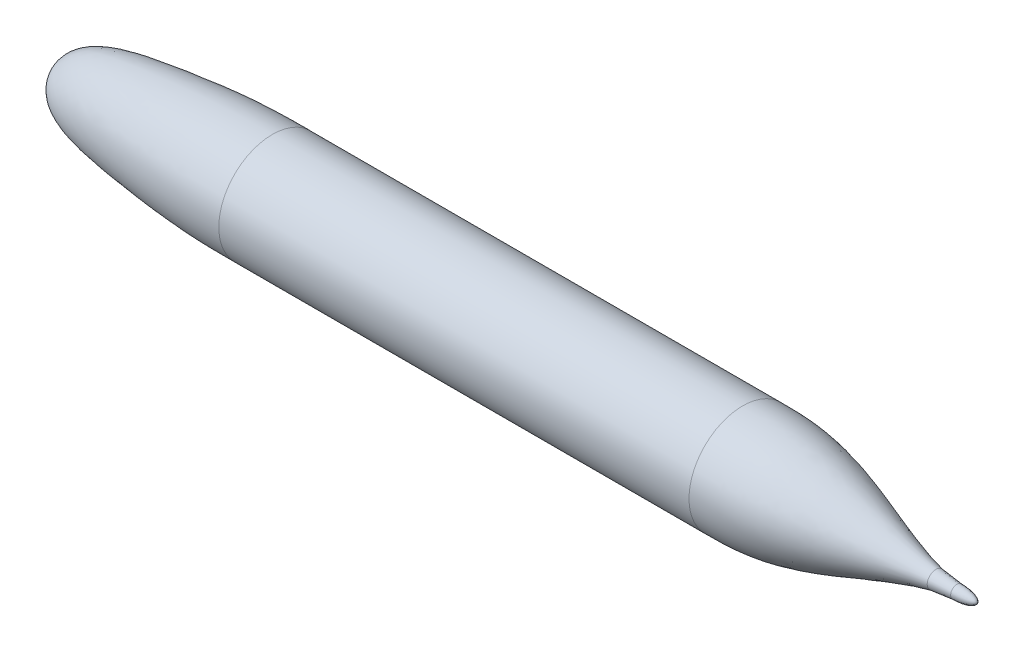
ISO-10303-21;
HEADER;
FILE_DESCRIPTION(('STEP AP214'),'2;1');
FILE_NAME('part.step','',(''),(''),'','','');
FILE_SCHEMA(('AUTOMOTIVE_DESIGN { 1 0 10303 214 1 1 1 1 }'));
ENDSEC;
DATA;
#1=APPLICATION_CONTEXT('core data for automotive mechanical design processes');
#2=APPLICATION_PROTOCOL_DEFINITION('international standard','automotive_design',2000,#1);
#3=PRODUCT_CONTEXT('',#1,'mechanical');
#4=PRODUCT('Part','Part','',(#3));
#5=PRODUCT_RELATED_PRODUCT_CATEGORY('part','',(#4));
#6=PRODUCT_DEFINITION_FORMATION('','',#4);
#7=PRODUCT_DEFINITION_CONTEXT('part definition',#1,'design');
#8=PRODUCT_DEFINITION('design','',#6,#7);
#9=PRODUCT_DEFINITION_SHAPE('','',#8);
#10=(LENGTH_UNIT() NAMED_UNIT(*) SI_UNIT(.MILLI.,.METRE.));
#11=(NAMED_UNIT(*) PLANE_ANGLE_UNIT() SI_UNIT($,.RADIAN.));
#12=(NAMED_UNIT(*) SI_UNIT($,.STERADIAN.) SOLID_ANGLE_UNIT());
#13=UNCERTAINTY_MEASURE_WITH_UNIT(LENGTH_MEASURE(1.E-05),#10,'distance_accuracy_value','');
#14=(GEOMETRIC_REPRESENTATION_CONTEXT(3) GLOBAL_UNCERTAINTY_ASSIGNED_CONTEXT((#13)) GLOBAL_UNIT_ASSIGNED_CONTEXT((#10,
#11,#12)) REPRESENTATION_CONTEXT('',''));
#15=CARTESIAN_POINT('',(0.,0.,0.));
#16=DIRECTION('',(0.,0.,1.));
#17=DIRECTION('',(1.,0.,0.));
#18=AXIS2_PLACEMENT_3D('',#15,#16,#17);
#19=CARTESIAN_POINT('',(4356.10056124605,0.,0.));
#20=DIRECTION('',(1.,0.,0.));
#21=DIRECTION('',(0.,0.,-1.));
#22=AXIS2_PLACEMENT_3D('',#19,#20,#21);
#23=PLANE('',#22);
#24=CARTESIAN_POINT('',(4356.0996825,0.,0.));
#25=DIRECTION('',(-1.,0.,0.));
#26=DIRECTION('',(0.,0.,-1.));
#27=AXIS2_PLACEMENT_3D('',#24,#25,#26);
#28=CIRCLE('',#27,0.0523166977989962);
#29=CARTESIAN_POINT('',(4356.0996825,0.,-0.0523166977989962));
#30=VERTEX_POINT('',#29);
#31=EDGE_CURVE('E11',#30,#30,#28,.F.);
#32=ORIENTED_EDGE('',*,*,#31,.T.);
#33=EDGE_LOOP('',(#32));
#34=FACE_BOUND('',#33,.T.);
#35=ADVANCED_FACE('F33',(#34),#23,.T.);
#36=CARTESIAN_POINT('',(4356.0996825,0.0523166977989962,0.));
#37=CARTESIAN_POINT('',(4356.09820510337,0.316375173884662,0.));
#38=CARTESIAN_POINT('',(4356.07328648779,0.873370162688149,0.));
#39=CARTESIAN_POINT('',(4355.97661854429,1.661731568693,0.));
#40=CARTESIAN_POINT('',(4355.73060631043,2.70263675821918,0.));
#41=CARTESIAN_POINT('',(4355.37771903531,3.73180193912385,0.));
#42=CARTESIAN_POINT('',(4354.88931306076,4.79395036815117,0.));
#43=CARTESIAN_POINT('',(4354.24380055822,5.91010552001094,0.));
#44=CARTESIAN_POINT('',(4353.40553185371,7.09434031631562,0.));
#45=CARTESIAN_POINT('',(4352.29516133093,8.40000321988059,0.));
#46=CARTESIAN_POINT('',(4350.8854069248,9.78923323718644,0.));
#47=CARTESIAN_POINT('',(4348.97726767036,11.381324846722,0.));
#48=CARTESIAN_POINT('',(4346.57909581715,13.0670533568304,0.));
#49=CARTESIAN_POINT('',(4343.61561851952,14.8313255512474,0.));
#50=CARTESIAN_POINT('',(4339.47901953081,16.9266101916491,0.));
#51=CARTESIAN_POINT('',(4334.34212574806,19.076095309961,0.));
#52=CARTESIAN_POINT('',(4328.25751531957,21.1786783680278,0.));
#53=CARTESIAN_POINT('',(4321.31870381039,23.1253204070093,0.));
#54=CARTESIAN_POINT('',(4314.37014831795,24.7519541055529,0.));
#55=CARTESIAN_POINT('',(4307.25196288843,26.1066906964655,0.));
#56=CARTESIAN_POINT('',(4300.27433543783,27.2230172646972,0.));
#57=CARTESIAN_POINT('',(4292.96906602332,28.1246545151776,0.));
#58=CARTESIAN_POINT('',(4286.13004348403,28.8286673265875,0.));
#59=CARTESIAN_POINT('',(4278.47083825818,29.3471768576665,0.));
#60=CARTESIAN_POINT('',(4272.13194197613,29.6885256465989,0.));
#61=CARTESIAN_POINT('',(4265.71990054262,29.8155871271278,0.));
#62=CARTESIAN_POINT('',(4262.49491853752,29.8438240903976,0.));
#63=CARTESIAN_POINT('',(4260.85,29.8438249999535,0.));
#64=B_SPLINE_CURVE_WITH_KNOTS('',4,(#36,#37,#38,#39,#40,#41,#42,#43,#44,#45,#46,#47,#48,#49,#50,
#51,#52,#53,#54,#55,#56,#57,#58,#59,#60,#61,#62,#63),.UNSPECIFIED.,.F.,.F.,(5,1,1,1,1,1,1,1,1,1,
1,1,1,1,1,1,1,1,1,1,1,1,1,1,5),(0.0831570128130642,0.0932132570591594,0.101696964389373,
0.11075726061743,0.12069275109169,0.130972070658317,0.142548140500437,0.155658788918111,
0.171319331135553,0.190714329760923,0.211595299247817,0.24229908639775,0.273620523948674,
0.310925868993426,0.373568932587312,0.43621204297724,0.498855141084512,0.561498245117138,
0.624141354230334,0.68678446091887,0.749427568519341,0.812070674490438,0.874713784038248,
0.937356891908962,1.),.UNSPECIFIED.);
#65=CARTESIAN_POINT('',(4573.90534435914,0.,0.));
#66=DIRECTION('',(1.,0.,0.));
#67=AXIS1_PLACEMENT('',#65,#66);
#68=SURFACE_OF_REVOLUTION('',#64,#67);
#69=CARTESIAN_POINT('',(4260.85000000714,0.,0.));
#70=DIRECTION('',(1.,0.,0.));
#71=DIRECTION('',(0.,0.,-1.));
#72=AXIS2_PLACEMENT_3D('',#69,#70,#71);
#73=CIRCLE('',#72,29.8438249999535);
#74=CARTESIAN_POINT('',(4260.85000000714,0.,-29.8438249999535));
#75=VERTEX_POINT('',#74);
#76=EDGE_CURVE('E42',#75,#75,#73,.T.);
#77=ORIENTED_EDGE('',*,*,#76,.T.);
#78=EDGE_LOOP('',(#77));
#79=FACE_BOUND('',#78,.T.);
#80=ORIENTED_EDGE('',*,*,#31,.F.);
#81=EDGE_LOOP('',(#80));
#82=FACE_BOUND('',#81,.T.);
#83=ADVANCED_FACE('F80',(#79,#82),#68,.F.);
#84=CARTESIAN_POINT('',(4260.85000000714,0.,0.));
#85=DIRECTION('',(-1.,0.,0.));
#86=DIRECTION('',(0.,0.,1.));
#87=AXIS2_PLACEMENT_3D('',#84,#85,#86);
#88=CONICAL_SURFACE('',#87,29.8438249999535,0.109828003160682);
#89=CARTESIAN_POINT('',(4160.85,0.,0.));
#90=DIRECTION('',(1.,0.,0.));
#91=DIRECTION('',(0.,0.,-1.));
#92=AXIS2_PLACEMENT_3D('',#89,#90,#91);
#93=CIRCLE('',#92,40.8709982989884);
#94=CARTESIAN_POINT('',(4160.85,0.,-40.8709982989884));
#95=VERTEX_POINT('',#94);
#96=EDGE_CURVE('E57',#95,#95,#93,.T.);
#97=ORIENTED_EDGE('',*,*,#96,.T.);
#98=EDGE_LOOP('',(#97));
#99=FACE_BOUND('',#98,.T.);
#100=ORIENTED_EDGE('',*,*,#76,.F.);
#101=EDGE_LOOP('',(#100));
#102=FACE_BOUND('',#101,.T.);
#103=ADVANCED_FACE('F82',(#99,#102),#88,.T.);
#104=CARTESIAN_POINT('',(4160.85,40.8709982989884,0.));
#105=CARTESIAN_POINT('',(4153.84600983632,42.2709247139687,0.));
#106=CARTESIAN_POINT('',(4140.42410329853,45.2071914485555,0.));
#107=CARTESIAN_POINT('',(4102.21757895522,54.036624874343,0.));
#108=CARTESIAN_POINT('',(4064.11986527113,65.0876103963693,0.));
#109=CARTESIAN_POINT('',(4005.09594301792,82.6917891560129,0.));
#110=CARTESIAN_POINT('',(3947.05636135046,102.573879564555,0.));
#111=CARTESIAN_POINT('',(3879.53811864114,125.912656390393,0.));
#112=CARTESIAN_POINT('',(3815.29035419516,148.738599340808,0.));
#113=CARTESIAN_POINT('',(3748.94229579602,171.379044667908,0.));
#114=CARTESIAN_POINT('',(3686.49008101157,191.389092097747,0.));
#115=CARTESIAN_POINT('',(3631.30676523074,207.308438799114,0.));
#116=CARTESIAN_POINT('',(3584.05811283757,219.234459043739,0.));
#117=CARTESIAN_POINT('',(3545.40749116941,227.954902144445,0.));
#118=CARTESIAN_POINT('',(3510.62360174647,234.606467752144,0.));
#119=CARTESIAN_POINT('',(3477.77329878849,240.310670761571,0.));
#120=CARTESIAN_POINT('',(3441.02861186639,244.989357501931,0.));
#121=CARTESIAN_POINT('',(3410.39529982497,248.637070822982,0.));
#122=CARTESIAN_POINT('',(3367.76569552751,251.39767800737,0.));
#123=CARTESIAN_POINT('',(3333.93475542781,253.489258959349,0.));
#124=CARTESIAN_POINT('',(3281.60309249848,253.989640711867,0.));
#125=CARTESIAN_POINT('',(3259.371699295,253.989999999884,0.));
#126=CARTESIAN_POINT('',(3244.8498,253.99,0.));
#127=B_SPLINE_CURVE_WITH_KNOTS('',4,(#104,#105,#106,#107,#108,#109,#110,#111,#112,#113,#114,
#115,#116,#117,#118,#119,#120,#121,#122,#123,#124,#125,#126),.UNSPECIFIED.,.F.,.F.,(5,1,1,1,1,1,
1,1,1,1,1,1,1,1,1,1,1,1,1,5),(0.0810847900249246,0.111284906786512,0.141985748071414,
0.187180553096844,0.248582237306456,0.309983921757261,0.371385605340465,0.432787285034535,
0.494188973564617,0.555590654293261,0.604896461982859,0.635597316206356,0.666298161622039,
0.696998982926671,0.727699824418843,0.758400664737475,0.789101493940164,0.819802335724077,
0.856854160899539,0.918255838806902),.UNSPECIFIED.);
#128=CARTESIAN_POINT('',(4573.90534435914,0.,0.));
#129=DIRECTION('',(1.,0.,0.));
#130=AXIS1_PLACEMENT('',#128,#129);
#131=SURFACE_OF_REVOLUTION('',#127,#130);
#132=CARTESIAN_POINT('',(3244.84979986379,0.,0.));
#133=DIRECTION('',(1.,0.,0.));
#134=DIRECTION('',(0.,0.,-1.));
#135=AXIS2_PLACEMENT_3D('',#132,#133,#134);
#136=CIRCLE('',#135,253.99);
#137=CARTESIAN_POINT('',(3244.84979986379,0.,-253.99));
#138=VERTEX_POINT('',#137);
#139=EDGE_CURVE('E54',#138,#138,#136,.T.);
#140=ORIENTED_EDGE('',*,*,#139,.T.);
#141=EDGE_LOOP('',(#140));
#142=FACE_BOUND('',#141,.T.);
#143=ORIENTED_EDGE('',*,*,#96,.F.);
#144=EDGE_LOOP('',(#143));
#145=FACE_BOUND('',#144,.T.);
#146=ADVANCED_FACE('F88',(#142,#145),#131,.F.);
#147=CARTESIAN_POINT('',(4573.90534435914,0.,0.));
#148=DIRECTION('',(1.,0.,0.));
#149=DIRECTION('',(0.,0.,-1.));
#150=AXIS2_PLACEMENT_3D('',#147,#148,#149);
#151=CYLINDRICAL_SURFACE('',#150,253.99);
#152=CARTESIAN_POINT('',(1015.99000000001,0.,0.));
#153=DIRECTION('',(1.,0.,0.));
#154=DIRECTION('',(0.,0.,-1.));
#155=AXIS2_PLACEMENT_3D('',#152,#153,#154);
#156=CIRCLE('',#155,253.989999999999);
#157=CARTESIAN_POINT('',(1015.99000000001,0.,-253.989999999999));
#158=VERTEX_POINT('',#157);
#159=EDGE_CURVE('E52',#158,#158,#156,.T.);
#160=ORIENTED_EDGE('',*,*,#159,.T.);
#161=EDGE_LOOP('',(#160));
#162=FACE_BOUND('',#161,.T.);
#163=ORIENTED_EDGE('',*,*,#139,.F.);
#164=EDGE_LOOP('',(#163));
#165=FACE_BOUND('',#164,.T.);
#166=ADVANCED_FACE('F48',(#162,#165),#151,.T.);
#167=CARTESIAN_POINT('',(1015.99000000001,253.989999999999,0.));
#168=CARTESIAN_POINT('',(997.236784536971,253.989999996828,0.));
#169=CARTESIAN_POINT('',(960.522733127652,253.990116434015,0.));
#170=CARTESIAN_POINT('',(887.158052930429,253.527057115,0.));
#171=CARTESIAN_POINT('',(814.936372498532,251.064483931416,0.));
#172=CARTESIAN_POINT('',(727.364561071538,246.487142308408,0.));
#173=CARTESIAN_POINT('',(649.267194278834,239.956269717919,0.));
#174=CARTESIAN_POINT('',(565.634093237234,231.856017899871,0.));
#175=CARTESIAN_POINT('',(485.599300588926,222.605006047594,0.));
#176=CARTESIAN_POINT('',(403.525154499602,212.421689103146,0.));
#177=CARTESIAN_POINT('',(322.982555564909,201.025862912764,0.));
#178=CARTESIAN_POINT('',(251.243117450516,188.793925124821,0.));
#179=CARTESIAN_POINT('',(190.891203183136,174.943924166264,0.));
#180=CARTESIAN_POINT('',(144.57160373197,160.317876559633,0.));
#181=CARTESIAN_POINT('',(112.860797634321,147.365411021708,0.));
#182=CARTESIAN_POINT('',(87.5810677697967,134.289604744813,0.));
#183=CARTESIAN_POINT('',(68.3645062006847,122.020255451318,0.));
#184=CARTESIAN_POINT('',(52.5196310486452,109.6620611562,0.));
#185=CARTESIAN_POINT('',(39.8102105354947,97.6192858263837,0.));
#186=CARTESIAN_POINT('',(29.4389720790155,85.6876348096276,0.));
#187=CARTESIAN_POINT('',(20.9346384891394,73.7128234117473,0.));
#188=CARTESIAN_POINT('',(13.9914632073197,61.5535431483236,0.));
#189=CARTESIAN_POINT('',(8.44943971673947,49.072561683096,0.));
#190=CARTESIAN_POINT('',(4.28001597837805,36.2120699581761,0.));
#191=CARTESIAN_POINT('',(1.31207138731805,22.2912850615508,0.));
#192=CARTESIAN_POINT('',(0.232734864737176,11.5207073968899,0.));
#193=CARTESIAN_POINT('',(-0.0135546827813091,4.12705357302919,0.));
#194=CARTESIAN_POINT('',(0.,0.,0.));
#195=B_SPLINE_CURVE_WITH_KNOTS('',4,(#167,#168,#169,#170,#171,#172,#173,#174,#175,#176,#177,
#178,#179,#180,#181,#182,#183,#184,#185,#186,#187,#188,#189,#190,#191,#192,#193,#194),
.UNSPECIFIED.,.F.,.F.,(5,1,1,1,1,1,1,1,1,1,1,1,1,1,1,1,1,1,1,1,1,1,1,1,5),(0.,
0.0675830491827124,0.135166098434965,0.202749147013917,0.270332195153977,0.337915243924512,
0.405498295151711,0.473081342370502,0.540664390493235,0.608247435082558,0.675830484687241,
0.712124984475291,0.745582612310353,0.768110401379704,0.788969196920152,0.805864773026303,
0.820807255775163,0.834323211560267,0.846704431290529,0.857968093271073,0.869226272546674,
0.880475810816033,0.891711528904265,0.902522282046638,0.916136835977159),.UNSPECIFIED.);
#196=CARTESIAN_POINT('',(4573.90534435914,0.,0.));
#197=DIRECTION('',(1.,0.,0.));
#198=AXIS1_PLACEMENT('',#196,#197);
#199=SURFACE_OF_REVOLUTION('',#195,#198);
#200=CARTESIAN_POINT('',(0.,0.,0.));
#201=VERTEX_POINT('',#200);
#202=VERTEX_LOOP('',#201);
#203=FACE_BOUND('',#202,.T.);
#204=ORIENTED_EDGE('',*,*,#159,.F.);
#205=EDGE_LOOP('',(#204));
#206=FACE_BOUND('',#205,.T.);
#207=ADVANCED_FACE('F45',(#203,#206),#199,.F.);
#208=CLOSED_SHELL('',(#35,#83,#103,#146,#166,#207));
#209=MANIFOLD_SOLID_BREP('B2',#208);
#210=ADVANCED_BREP_SHAPE_REPRESENTATION('',(#18,#209),#14);
#211=SHAPE_DEFINITION_REPRESENTATION(#9,#210);
ENDSEC;
END-ISO-10303-21;
